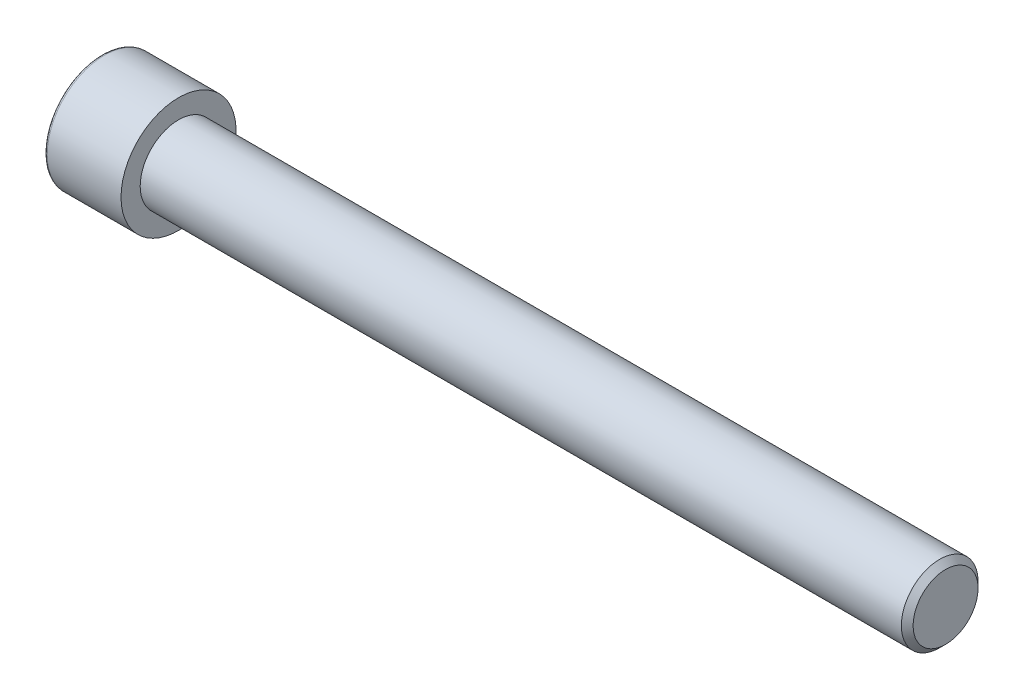
ISO-10303-21;
HEADER;
FILE_DESCRIPTION(('STEP AP214'),'2;1');
FILE_NAME('part.step','',(''),(''),'','','');
FILE_SCHEMA(('AUTOMOTIVE_DESIGN { 1 0 10303 214 1 1 1 1 }'));
ENDSEC;
DATA;
#1=APPLICATION_CONTEXT('core data for automotive mechanical design processes');
#2=APPLICATION_PROTOCOL_DEFINITION('international standard','automotive_design',2000,#1);
#3=PRODUCT_CONTEXT('',#1,'mechanical');
#4=PRODUCT('Part','Part','',(#3));
#5=PRODUCT_RELATED_PRODUCT_CATEGORY('part','',(#4));
#6=PRODUCT_DEFINITION_FORMATION('','',#4);
#7=PRODUCT_DEFINITION_CONTEXT('part definition',#1,'design');
#8=PRODUCT_DEFINITION('design','',#6,#7);
#9=PRODUCT_DEFINITION_SHAPE('','',#8);
#10=(LENGTH_UNIT() NAMED_UNIT(*) SI_UNIT(.MILLI.,.METRE.));
#11=(NAMED_UNIT(*) PLANE_ANGLE_UNIT() SI_UNIT($,.RADIAN.));
#12=(NAMED_UNIT(*) SI_UNIT($,.STERADIAN.) SOLID_ANGLE_UNIT());
#13=UNCERTAINTY_MEASURE_WITH_UNIT(LENGTH_MEASURE(1.E-05),#10,'distance_accuracy_value','');
#14=(GEOMETRIC_REPRESENTATION_CONTEXT(3) GLOBAL_UNCERTAINTY_ASSIGNED_CONTEXT((#13)) GLOBAL_UNIT_ASSIGNED_CONTEXT((#10,
#11,#12)) REPRESENTATION_CONTEXT('',''));
#15=CARTESIAN_POINT('',(0.,0.,0.));
#16=DIRECTION('',(0.,0.,1.));
#17=DIRECTION('',(1.,0.,0.));
#18=AXIS2_PLACEMENT_3D('',#15,#16,#17);
#19=CARTESIAN_POINT('',(0.,0.,0.));
#20=DIRECTION('',(1.,0.,0.));
#21=DIRECTION('',(0.,0.,-1.));
#22=AXIS2_PLACEMENT_3D('',#19,#20,#21);
#23=PLANE('',#22);
#24=DIRECTION('',(0.,-0.5,0.866025403784439));
#25=VECTOR('',#24,1.);
#26=CARTESIAN_POINT('',(0.,8.08290376865476,0.));
#27=LINE('',#26,#25);
#28=CARTESIAN_POINT('',(0.,8.08290376865476,0.));
#29=VERTEX_POINT('',#28);
#30=CARTESIAN_POINT('',(0.,4.04145188432738,7.));
#31=VERTEX_POINT('',#30);
#32=EDGE_CURVE('E100',#29,#31,#27,.T.);
#33=ORIENTED_EDGE('',*,*,#32,.T.);
#34=DIRECTION('',(0.,-1.,0.));
#35=VECTOR('',#34,1.);
#36=CARTESIAN_POINT('',(0.,4.04145188432738,7.));
#37=LINE('',#36,#35);
#38=CARTESIAN_POINT('',(0.,-4.04145188432738,7.));
#39=VERTEX_POINT('',#38);
#40=EDGE_CURVE('E107',#31,#39,#37,.T.);
#41=ORIENTED_EDGE('',*,*,#40,.T.);
#42=DIRECTION('',(0.,-0.5,-0.866025403784439));
#43=VECTOR('',#42,1.);
#44=CARTESIAN_POINT('',(0.,-4.04145188432738,7.));
#45=LINE('',#44,#43);
#46=CARTESIAN_POINT('',(0.,-8.08290376865476,0.));
#47=VERTEX_POINT('',#46);
#48=EDGE_CURVE('E113',#39,#47,#45,.T.);
#49=ORIENTED_EDGE('',*,*,#48,.T.);
#50=DIRECTION('',(0.,0.5,-0.866025403784439));
#51=VECTOR('',#50,1.);
#52=CARTESIAN_POINT('',(0.,-8.08290376865476,0.));
#53=LINE('',#52,#51);
#54=CARTESIAN_POINT('',(0.,-4.04145188432738,-7.));
#55=VERTEX_POINT('',#54);
#56=EDGE_CURVE('E122',#47,#55,#53,.T.);
#57=ORIENTED_EDGE('',*,*,#56,.T.);
#58=DIRECTION('',(0.,1.,0.));
#59=VECTOR('',#58,1.);
#60=CARTESIAN_POINT('',(0.,-4.04145188432738,-7.));
#61=LINE('',#60,#59);
#62=CARTESIAN_POINT('',(0.,4.04145188432738,-7.));
#63=VERTEX_POINT('',#62);
#64=EDGE_CURVE('E125',#55,#63,#61,.T.);
#65=ORIENTED_EDGE('',*,*,#64,.T.);
#66=DIRECTION('',(0.,0.5,0.866025403784439));
#67=VECTOR('',#66,1.);
#68=CARTESIAN_POINT('',(0.,4.04145188432738,-7.));
#69=LINE('',#68,#67);
#70=EDGE_CURVE('E118',#63,#29,#69,.T.);
#71=ORIENTED_EDGE('',*,*,#70,.T.);
#72=EDGE_LOOP('',(#33,#41,#49,#57,#65,#71));
#73=FACE_BOUND('',#72,.T.);
#74=CARTESIAN_POINT('',(0.,0.,0.));
#75=DIRECTION('',(-1.,0.,0.));
#76=DIRECTION('',(0.,0.,1.));
#77=AXIS2_PLACEMENT_3D('',#74,#75,#76);
#78=CIRCLE('',#77,11.4);
#79=CARTESIAN_POINT('',(0.,0.,11.4));
#80=VERTEX_POINT('',#79);
#81=EDGE_CURVE('E142',#80,#80,#78,.T.);
#82=ORIENTED_EDGE('',*,*,#81,.T.);
#83=EDGE_LOOP('',(#82));
#84=FACE_BOUND('',#83,.T.);
#85=ADVANCED_FACE('F39',(#73,#84),#23,.F.);
#86=CARTESIAN_POINT('',(16.,12.,0.));
#87=DIRECTION('',(-1.,0.,0.));
#88=DIRECTION('',(0.,0.,1.));
#89=AXIS2_PLACEMENT_3D('',#86,#87,#88);
#90=PLANE('',#89);
#91=CARTESIAN_POINT('',(16.,0.,0.));
#92=DIRECTION('',(-1.,0.,0.));
#93=DIRECTION('',(0.,0.,1.));
#94=AXIS2_PLACEMENT_3D('',#91,#92,#93);
#95=CIRCLE('',#94,12.);
#96=CARTESIAN_POINT('',(16.,0.,12.));
#97=VERTEX_POINT('',#96);
#98=EDGE_CURVE('E148',#97,#97,#95,.T.);
#99=ORIENTED_EDGE('',*,*,#98,.F.);
#100=EDGE_LOOP('',(#99));
#101=FACE_BOUND('',#100,.T.);
#102=CARTESIAN_POINT('',(16.,0.,0.));
#103=DIRECTION('',(-1.,0.,0.));
#104=DIRECTION('',(0.,0.,1.));
#105=AXIS2_PLACEMENT_3D('',#102,#103,#104);
#106=CIRCLE('',#105,8.);
#107=CARTESIAN_POINT('',(16.,0.,8.));
#108=VERTEX_POINT('',#107);
#109=EDGE_CURVE('E151',#108,#108,#106,.F.);
#110=ORIENTED_EDGE('',*,*,#109,.F.);
#111=EDGE_LOOP('',(#110));
#112=FACE_BOUND('',#111,.T.);
#113=ADVANCED_FACE('F210',(#101,#112),#90,.F.);
#114=CARTESIAN_POINT('',(16.,0.,0.));
#115=DIRECTION('',(-1.,0.,0.));
#116=DIRECTION('',(0.,0.,1.));
#117=AXIS2_PLACEMENT_3D('',#114,#115,#116);
#118=CYLINDRICAL_SURFACE('',#117,12.);
#119=CARTESIAN_POINT('',(0.6,0.,0.));
#120=DIRECTION('',(-1.,0.,0.));
#121=DIRECTION('',(0.,0.,1.));
#122=AXIS2_PLACEMENT_3D('',#119,#120,#121);
#123=CIRCLE('',#122,12.);
#124=CARTESIAN_POINT('',(0.6,0.,12.));
#125=VERTEX_POINT('',#124);
#126=EDGE_CURVE('E145',#125,#125,#123,.T.);
#127=ORIENTED_EDGE('',*,*,#126,.F.);
#128=EDGE_LOOP('',(#127));
#129=FACE_BOUND('',#128,.T.);
#130=ORIENTED_EDGE('',*,*,#98,.T.);
#131=EDGE_LOOP('',(#130));
#132=FACE_BOUND('',#131,.T.);
#133=ADVANCED_FACE('F214',(#129,#132),#118,.T.);
#134=CARTESIAN_POINT('',(0.600000000000005,0.,0.));
#135=DIRECTION('',(-1.,0.,0.));
#136=DIRECTION('',(0.,0.,1.));
#137=AXIS2_PLACEMENT_3D('',#134,#135,#136);
#138=TOROIDAL_SURFACE('',#137,11.4,0.600000000000009);
#139=ORIENTED_EDGE('',*,*,#126,.T.);
#140=EDGE_LOOP('',(#139));
#141=FACE_BOUND('',#140,.T.);
#142=ORIENTED_EDGE('',*,*,#81,.F.);
#143=EDGE_LOOP('',(#142));
#144=FACE_BOUND('',#143,.T.);
#145=ADVANCED_FACE('F220',(#141,#144),#138,.T.);
#146=CARTESIAN_POINT('',(176.,0.,0.));
#147=DIRECTION('',(-1.,0.,0.));
#148=DIRECTION('',(0.,0.,1.));
#149=AXIS2_PLACEMENT_3D('',#146,#147,#148);
#150=CYLINDRICAL_SURFACE('',#149,8.);
#151=ORIENTED_EDGE('',*,*,#109,.T.);
#152=EDGE_LOOP('',(#151));
#153=FACE_BOUND('',#152,.T.);
#154=CARTESIAN_POINT('',(174.773,0.,0.));
#155=DIRECTION('',(-1.,0.,0.));
#156=DIRECTION('',(0.,0.,1.));
#157=AXIS2_PLACEMENT_3D('',#154,#155,#156);
#158=CIRCLE('',#157,8.);
#159=CARTESIAN_POINT('',(174.773,0.,8.));
#160=VERTEX_POINT('',#159);
#161=EDGE_CURVE('E139',#160,#160,#158,.T.);
#162=ORIENTED_EDGE('',*,*,#161,.T.);
#163=EDGE_LOOP('',(#162));
#164=FACE_BOUND('',#163,.T.);
#165=ADVANCED_FACE('F227',(#153,#164),#150,.T.);
#166=CARTESIAN_POINT('',(176.,0.,0.));
#167=DIRECTION('',(-1.,0.,0.));
#168=DIRECTION('',(0.,0.,1.));
#169=AXIS2_PLACEMENT_3D('',#166,#167,#168);
#170=CONICAL_SURFACE('',#169,6.773,0.785398163397457);
#171=ORIENTED_EDGE('',*,*,#161,.F.);
#172=EDGE_LOOP('',(#171));
#173=FACE_BOUND('',#172,.T.);
#174=CARTESIAN_POINT('',(176.,0.,0.));
#175=DIRECTION('',(-1.,0.,0.));
#176=DIRECTION('',(0.,0.,1.));
#177=AXIS2_PLACEMENT_3D('',#174,#175,#176);
#178=CIRCLE('',#177,6.773);
#179=CARTESIAN_POINT('',(176.,0.,6.773));
#180=VERTEX_POINT('',#179);
#181=EDGE_CURVE('E103',#180,#180,#178,.T.);
#182=ORIENTED_EDGE('',*,*,#181,.T.);
#183=EDGE_LOOP('',(#182));
#184=FACE_BOUND('',#183,.T.);
#185=ADVANCED_FACE('F207',(#173,#184),#170,.T.);
#186=CARTESIAN_POINT('',(176.,6.773,0.));
#187=DIRECTION('',(-1.,0.,0.));
#188=DIRECTION('',(0.,0.,1.));
#189=AXIS2_PLACEMENT_3D('',#186,#187,#188);
#190=PLANE('',#189);
#191=ORIENTED_EDGE('',*,*,#181,.F.);
#192=EDGE_LOOP('',(#191));
#193=FACE_BOUND('',#192,.T.);
#194=ADVANCED_FACE('F203',(#193),#190,.F.);
#195=CARTESIAN_POINT('',(12.,8.08290376865476,0.));
#196=DIRECTION('',(0.,-0.866025403784439,-0.5));
#197=DIRECTION('',(0.,0.5,-0.866025403784439));
#198=AXIS2_PLACEMENT_3D('',#195,#196,#197);
#199=PLANE('',#198);
#200=DIRECTION('',(-1.,0.,0.));
#201=VECTOR('',#200,1.);
#202=CARTESIAN_POINT('',(12.,8.08290376865476,0.));
#203=LINE('',#202,#201);
#204=CARTESIAN_POINT('',(8.24081062144515,8.08290376865476,0.));
#205=VERTEX_POINT('',#204);
#206=EDGE_CURVE('E128',#205,#29,#203,.T.);
#207=ORIENTED_EDGE('',*,*,#206,.F.);
#208=CARTESIAN_POINT('',(8.24074395334994,8.0830192387086,-0.000200000000000299));
#209=CARTESIAN_POINT('',(8.29202555673095,7.99418356332252,0.153667903293391));
#210=CARTESIAN_POINT('',(8.34097980978085,7.90501666556988,0.30810950055425));
#211=CARTESIAN_POINT('',(8.4335926165143,7.72595873929905,0.618246926353254));
#212=CARTESIAN_POINT('',(8.47724888570507,7.63606741609896,0.773943265295415));
#213=CARTESIAN_POINT('',(8.59941381160494,7.36495417725225,1.24352516958246));
#214=CARTESIAN_POINT('',(8.66889984688949,7.18266208641081,1.5592643327378));
#215=CARTESIAN_POINT('',(8.75038044738534,6.9098652897096,2.03176224476633));
#216=CARTESIAN_POINT('',(8.77359191890296,6.82017566928259,2.18710922425749));
#217=CARTESIAN_POINT('',(8.81251418935198,6.64039116946081,2.49850511236216));
#218=CARTESIAN_POINT('',(8.82822565100491,6.55029632658303,2.65455395772641));
#219=CARTESIAN_POINT('',(8.85174749050138,6.36995016641051,2.96692267009517));
#220=CARTESIAN_POINT('',(8.85956683512157,6.27969914366237,3.12324202693001));
#221=CARTESIAN_POINT('',(8.86714516201213,6.09911871281642,3.43601650800788));
#222=CARTESIAN_POINT('',(8.86690439329045,6.00878930722637,3.59247162790734));
#223=CARTESIAN_POINT('',(8.85516567196884,5.76131663355911,4.02110687218394));
#224=CARTESIAN_POINT('',(8.83545966104152,5.60425437562033,4.2931466828854));
#225=CARTESIAN_POINT('',(8.77297194365867,5.29117305327856,4.8354194400822));
#226=CARTESIAN_POINT('',(8.73016887967145,5.13515508991674,5.10565047951828));
#227=CARTESIAN_POINT('',(8.62317372407408,4.82144370220969,5.64901454193984));
#228=CARTESIAN_POINT('',(8.55852830921477,4.66378986193159,5.92207900330984));
#229=CARTESIAN_POINT('',(8.4118093319374,4.35083323311213,6.46413578499063));
#230=CARTESIAN_POINT('',(8.32977023275887,4.19552643669177,6.73313504715144));
#231=CARTESIAN_POINT('',(8.24074395334994,4.04133641427354,7.0002));
#232=B_SPLINE_CURVE_WITH_KNOTS('',3,(#208,#209,#210,#211,#212,#213,#214,#215,#216,#217,#218,
#219,#220,#221,#222,#223,#224,#225,#226,#227,#228,#229,#230,#231),.UNSPECIFIED.,.F.,.F.,(4,2,2,
2,2,2,2,2,2,2,2,4),(0.,0.554727910214695,1.10969417576209,2.2219327402719,2.76443041023617,
3.30688013473357,3.8487128486711,4.39052882332379,5.33376515141419,6.27787517570456,
7.2429241888324,8.20607866430097),.UNSPECIFIED.);
#233=CARTESIAN_POINT('',(8.24081062144515,4.04145188432738,7.));
#234=VERTEX_POINT('',#233);
#235=EDGE_CURVE('E11',#205,#234,#232,.T.);
#236=ORIENTED_EDGE('',*,*,#235,.T.);
#237=DIRECTION('',(-1.,0.,0.));
#238=VECTOR('',#237,1.);
#239=CARTESIAN_POINT('',(12.,4.04145188432738,7.));
#240=LINE('',#239,#238);
#241=EDGE_CURVE('E95',#234,#31,#240,.T.);
#242=ORIENTED_EDGE('',*,*,#241,.T.);
#243=ORIENTED_EDGE('',*,*,#32,.F.);
#244=EDGE_LOOP('',(#207,#236,#242,#243));
#245=FACE_BOUND('',#244,.T.);
#246=ADVANCED_FACE('F98',(#245),#199,.T.);
#247=CARTESIAN_POINT('',(12.,4.04145188432738,7.));
#248=DIRECTION('',(0.,0.,-1.));
#249=DIRECTION('',(-1.,0.,0.));
#250=AXIS2_PLACEMENT_3D('',#247,#248,#249);
#251=PLANE('',#250);
#252=ORIENTED_EDGE('',*,*,#241,.F.);
#253=CARTESIAN_POINT('',(5.57587941292219,-10.5951395559688,7.));
#254=CARTESIAN_POINT('',(5.72215788472476,-10.2913873854027,7.));
#255=CARTESIAN_POINT('',(5.86695568880045,-9.98690898111586,7.));
#256=CARTESIAN_POINT('',(6.15275105757623,-9.37611217415566,7.));
#257=CARTESIAN_POINT('',(6.29374796487649,-9.06979346424692,7.));
#258=CARTESIAN_POINT('',(6.57186848515588,-8.45322208251383,7.));
#259=CARTESIAN_POINT('',(6.70896439043919,-8.14295686634533,7.));
#260=CARTESIAN_POINT('',(6.97718199770579,-7.51986421385499,7.));
#261=CARTESIAN_POINT('',(7.10830400201994,-7.20703690814435,7.));
#262=CARTESIAN_POINT('',(7.36656028504088,-6.5695005443991,7.));
#263=CARTESIAN_POINT('',(7.49348005127018,-6.24470408202464,7.));
#264=CARTESIAN_POINT('',(7.73706702336103,-5.59121778689269,7.));
#265=CARTESIAN_POINT('',(7.85373304467385,-5.26252750927219,7.));
#266=CARTESIAN_POINT('',(8.07355811047227,-4.60143032919695,7.));
#267=CARTESIAN_POINT('',(8.17674688296708,-4.2690334243111,7.));
#268=CARTESIAN_POINT('',(8.36613945739777,-3.59949554460914,7.));
#269=CARTESIAN_POINT('',(8.45234888881718,-3.2623561820045,7.));
#270=CARTESIAN_POINT('',(8.60305564581958,-2.58479315996282,7.));
#271=CARTESIAN_POINT('',(8.66765350449936,-2.24439250484352,7.));
#272=CARTESIAN_POINT('',(8.74539831642546,-1.73091216973467,7.));
#273=CARTESIAN_POINT('',(8.7681223476882,-1.55925781299778,7.));
#274=CARTESIAN_POINT('',(8.80673620890492,-1.21518758086266,7.));
#275=CARTESIAN_POINT('',(8.82262668929935,-1.04277177952026,7.));
#276=CARTESIAN_POINT('',(8.84707027467927,-0.699545376197852,7.));
#277=CARTESIAN_POINT('',(8.85571101390069,-0.528741034985779,7.));
#278=CARTESIAN_POINT('',(8.86578587656476,-0.1869208499621,7.));
#279=CARTESIAN_POINT('',(8.86722011156257,-0.0159050094654492,7.));
#280=CARTESIAN_POINT('',(8.86284767868586,0.326038893609979,7.));
#281=CARTESIAN_POINT('',(8.85704082162707,0.496966953778641,7.));
#282=CARTESIAN_POINT('',(8.8383221933219,0.838436119348584,7.));
#283=CARTESIAN_POINT('',(8.82541002346138,1.00897720250108,7.));
#284=CARTESIAN_POINT('',(8.78532318764043,1.42691016284093,7.));
#285=CARTESIAN_POINT('',(8.75433158385114,1.67394276264429,7.));
#286=CARTESIAN_POINT('',(8.67919370737725,2.1659883041221,7.));
#287=CARTESIAN_POINT('',(8.63504542432949,2.41100093125723,7.));
#288=CARTESIAN_POINT('',(8.48522311454851,3.14282333035987,7.));
#289=CARTESIAN_POINT('',(8.36220388516809,3.62611875071593,7.));
#290=CARTESIAN_POINT('',(8.15116787960062,4.3487805325071,7.));
#291=CARTESIAN_POINT('',(8.07542139419739,4.59194251167669,7.));
#292=CARTESIAN_POINT('',(7.9166482621531,5.07590132488677,7.));
#293=CARTESIAN_POINT('',(7.83362156396132,5.31669814216627,7.));
#294=CARTESIAN_POINT('',(7.66157133885048,5.79601723780591,7.));
#295=CARTESIAN_POINT('',(7.5725500954382,6.03454034320772,7.));
#296=CARTESIAN_POINT('',(7.3894995127239,6.50964710521445,7.));
#297=CARTESIAN_POINT('',(7.29547025517154,6.74623079340525,7.));
#298=CARTESIAN_POINT('',(7.05091022334063,7.34607004782587,7.));
#299=CARTESIAN_POINT('',(6.89749500530549,7.70814802994476,7.));
#300=CARTESIAN_POINT('',(6.58311405374231,8.42902142446664,7.));
#301=CARTESIAN_POINT('',(6.4221477486436,8.78781658591592,7.));
#302=CARTESIAN_POINT('',(6.09434206590049,9.5028229612945,7.));
#303=CARTESIAN_POINT('',(5.92750112189063,9.85903345506375,7.));
#304=CARTESIAN_POINT('',(5.58925640841321,10.5692634953458,7.));
#305=CARTESIAN_POINT('',(5.41785276367774,10.9232831014262,7.));
#306=CARTESIAN_POINT('',(5.07120500870259,11.6299725078319,7.));
#307=CARTESIAN_POINT('',(4.8959564472764,11.982640120912,7.));
#308=CARTESIAN_POINT('',(4.54252537077448,12.6865021421779,7.));
#309=CARTESIAN_POINT('',(4.3643428393958,13.0376965421641,7.));
#310=CARTESIAN_POINT('',(3.82629497051468,14.0893490285881,7.));
#311=CARTESIAN_POINT('',(3.46287434288011,14.7879876175435,7.));
#312=CARTESIAN_POINT('',(2.76400520764348,16.1163630798682,7.));
#313=CARTESIAN_POINT('',(2.42913665633273,16.7464064050781,7.));
#314=CARTESIAN_POINT('',(1.75544455886196,18.0044087683408,7.));
#315=CARTESIAN_POINT('',(1.4166208425721,18.6323677152318,7.));
#316=CARTESIAN_POINT('',(0.736900591610472,19.8850342571872,7.));
#317=CARTESIAN_POINT('',(0.396011800685717,20.5097460603558,7.));
#318=CARTESIAN_POINT('',(-0.288064689435112,21.7578620874728,7.));
#319=CARTESIAN_POINT('',(-0.631252251240716,22.3812663866935,7.));
#320=CARTESIAN_POINT('',(-0.975285006989568,23.0042010690845,7.));
#321=B_SPLINE_CURVE_WITH_KNOTS('',3,(#253,#254,#255,#256,#257,#258,#259,#260,#261,#262,#263,
#264,#265,#266,#267,#268,#269,#270,#271,#272,#273,#274,#275,#276,#277,#278,#279,#280,#281,#282,
#283,#284,#285,#286,#287,#288,#289,#290,#291,#292,#293,#294,#295,#296,#297,#298,#299,#300,#301,
#302,#303,#304,#305,#306,#307,#308,#309,#310,#311,#312,#313,#314,#315,#316,#317,#318,#319,#320),
.UNSPECIFIED.,.F.,.F.,(4,2,2,2,2,2,2,2,2,2,2,2,2,2,2,2,2,2,2,2,2,2,2,2,2,2,2,2,2,2,2,2,2,4),(0.,
1.01143101724814,2.02303586270392,3.04059952013218,4.0581116227373,5.10411913857804,
6.15024733449321,7.19402754905384,8.23746111460828,9.27597104351024,9.79531214242649,
10.3146037977555,10.8275239688931,11.3404362001106,11.8533618322016,12.3663162427945,
13.1127965817182,13.8593910426537,15.3534778065278,16.1174816538324,16.8814909114363,
17.6452107630153,18.4089181516302,19.5885110371782,20.7681933551521,21.9481926318707,
23.1281596836154,24.3095735159024,25.4909939150696,27.8534625107793,29.9939673638473,
32.1345646316569,34.269560689375,36.4044302636885),.UNSPECIFIED.);
#322=CARTESIAN_POINT('',(8.24081062144515,-4.04145188432738,7.));
#323=VERTEX_POINT('',#322);
#324=EDGE_CURVE('E51',#234,#323,#321,.F.);
#325=ORIENTED_EDGE('',*,*,#324,.T.);
#326=DIRECTION('',(-1.,0.,0.));
#327=VECTOR('',#326,1.);
#328=CARTESIAN_POINT('',(12.,-4.04145188432738,7.));
#329=LINE('',#328,#327);
#330=EDGE_CURVE('E104',#323,#39,#329,.T.);
#331=ORIENTED_EDGE('',*,*,#330,.T.);
#332=ORIENTED_EDGE('',*,*,#40,.F.);
#333=EDGE_LOOP('',(#252,#325,#331,#332));
#334=FACE_BOUND('',#333,.T.);
#335=ADVANCED_FACE('F108',(#334),#251,.T.);
#336=CARTESIAN_POINT('',(12.,-4.04145188432738,7.));
#337=DIRECTION('',(0.,0.866025403784439,-0.5));
#338=DIRECTION('',(0.,0.5,0.866025403784439));
#339=AXIS2_PLACEMENT_3D('',#336,#337,#338);
#340=PLANE('',#339);
#341=ORIENTED_EDGE('',*,*,#330,.F.);
#342=CARTESIAN_POINT('',(8.24074395334994,-4.04133641427354,7.0002));
#343=CARTESIAN_POINT('',(8.29202555673095,-4.13017208965963,6.84633209670661));
#344=CARTESIAN_POINT('',(8.34097980978085,-4.21933898741226,6.69189049944575));
#345=CARTESIAN_POINT('',(8.4335926165143,-4.39839691368309,6.38175307364674));
#346=CARTESIAN_POINT('',(8.47724888570507,-4.48828823688319,6.22605673470458));
#347=CARTESIAN_POINT('',(8.59941381160494,-4.75940147572989,5.75647483041753));
#348=CARTESIAN_POINT('',(8.66889984688949,-4.94169356657133,5.4407356672622));
#349=CARTESIAN_POINT('',(8.75038044738534,-5.21449036327254,4.96823775523367));
#350=CARTESIAN_POINT('',(8.77359191890296,-5.30417998369956,4.81289077574251));
#351=CARTESIAN_POINT('',(8.81251418935198,-5.48396448352133,4.50149488763783));
#352=CARTESIAN_POINT('',(8.82822565100491,-5.57405932639911,4.34544604227359));
#353=CARTESIAN_POINT('',(8.85174749050138,-5.75440548657163,4.03307732990482));
#354=CARTESIAN_POINT('',(8.85956683512157,-5.84465650931978,3.87675797306999));
#355=CARTESIAN_POINT('',(8.86714516201213,-6.02523694016573,3.56398349199212));
#356=CARTESIAN_POINT('',(8.86690439329045,-6.11556634575578,3.40752837209266));
#357=CARTESIAN_POINT('',(8.85516567196884,-6.36303901942303,2.97889312781606));
#358=CARTESIAN_POINT('',(8.83545966104152,-6.52010127736182,2.7068533171146));
#359=CARTESIAN_POINT('',(8.77297194365867,-6.83318259970359,2.1645805599178));
#360=CARTESIAN_POINT('',(8.73016887967145,-6.9892005630654,1.89434952048172));
#361=CARTESIAN_POINT('',(8.62317372407408,-7.30291195077246,1.35098545806016));
#362=CARTESIAN_POINT('',(8.55852830921477,-7.46056579105055,1.07792099669016));
#363=CARTESIAN_POINT('',(8.4118093319374,-7.77352241987001,0.53586421500937));
#364=CARTESIAN_POINT('',(8.32977023275887,-7.92882921629037,0.266864952848559));
#365=CARTESIAN_POINT('',(8.24074395334994,-8.0830192387086,-0.000200000000000452));
#366=B_SPLINE_CURVE_WITH_KNOTS('',3,(#342,#343,#344,#345,#346,#347,#348,#349,#350,#351,#352,
#353,#354,#355,#356,#357,#358,#359,#360,#361,#362,#363,#364,#365),.UNSPECIFIED.,.F.,.F.,(4,2,2,
2,2,2,2,2,2,2,2,4),(0.,0.554727910214695,1.10969417576209,2.2219327402719,2.76443041023617,
3.30688013473358,3.8487128486711,4.39052882332379,5.33376515141419,6.27787517570456,
7.2429241888324,8.20607866430097),.UNSPECIFIED.);
#367=CARTESIAN_POINT('',(8.24081062144515,-8.08290376865476,0.));
#368=VERTEX_POINT('',#367);
#369=EDGE_CURVE('E61',#323,#368,#366,.T.);
#370=ORIENTED_EDGE('',*,*,#369,.T.);
#371=DIRECTION('',(-1.,0.,0.));
#372=VECTOR('',#371,1.);
#373=CARTESIAN_POINT('',(12.,-8.08290376865476,0.));
#374=LINE('',#373,#372);
#375=EDGE_CURVE('E134',#368,#47,#374,.T.);
#376=ORIENTED_EDGE('',*,*,#375,.T.);
#377=ORIENTED_EDGE('',*,*,#48,.F.);
#378=EDGE_LOOP('',(#341,#370,#376,#377));
#379=FACE_BOUND('',#378,.T.);
#380=ADVANCED_FACE('F183',(#379),#340,.T.);
#381=CARTESIAN_POINT('',(12.,-8.08290376865476,0.));
#382=DIRECTION('',(0.,0.866025403784439,0.5));
#383=DIRECTION('',(0.,-0.5,0.866025403784439));
#384=AXIS2_PLACEMENT_3D('',#381,#382,#383);
#385=PLANE('',#384);
#386=ORIENTED_EDGE('',*,*,#375,.F.);
#387=CARTESIAN_POINT('',(8.24074395334994,-8.0830192387086,0.000200000000000299));
#388=CARTESIAN_POINT('',(8.29202555673095,-7.99418356332252,-0.153667903293391));
#389=CARTESIAN_POINT('',(8.34097980978085,-7.90501666556988,-0.30810950055425));
#390=CARTESIAN_POINT('',(8.4335926165143,-7.72595873929905,-0.618246926353254));
#391=CARTESIAN_POINT('',(8.47724888570507,-7.63606741609896,-0.773943265295415));
#392=CARTESIAN_POINT('',(8.59941381160494,-7.36495417725225,-1.24352516958246));
#393=CARTESIAN_POINT('',(8.66889984688949,-7.18266208641081,-1.5592643327378));
#394=CARTESIAN_POINT('',(8.75038044738534,-6.9098652897096,-2.03176224476633));
#395=CARTESIAN_POINT('',(8.77359191890296,-6.82017566928259,-2.18710922425749));
#396=CARTESIAN_POINT('',(8.81251418935198,-6.64039116946081,-2.49850511236216));
#397=CARTESIAN_POINT('',(8.82822565100491,-6.55029632658303,-2.65455395772641));
#398=CARTESIAN_POINT('',(8.85174749050138,-6.36995016641051,-2.96692267009517));
#399=CARTESIAN_POINT('',(8.85956683512157,-6.27969914366237,-3.12324202693001));
#400=CARTESIAN_POINT('',(8.86714516201213,-6.09911871281642,-3.43601650800788));
#401=CARTESIAN_POINT('',(8.86690439329045,-6.00878930722637,-3.59247162790734));
#402=CARTESIAN_POINT('',(8.85516567196884,-5.76131663355911,-4.02110687218394));
#403=CARTESIAN_POINT('',(8.83545966104152,-5.60425437562033,-4.2931466828854));
#404=CARTESIAN_POINT('',(8.77297194365867,-5.29117305327856,-4.8354194400822));
#405=CARTESIAN_POINT('',(8.73016887967145,-5.13515508991674,-5.10565047951828));
#406=CARTESIAN_POINT('',(8.62317372407408,-4.82144370220969,-5.64901454193984));
#407=CARTESIAN_POINT('',(8.55852830921477,-4.66378986193159,-5.92207900330984));
#408=CARTESIAN_POINT('',(8.4118093319374,-4.35083323311213,-6.46413578499063));
#409=CARTESIAN_POINT('',(8.32977023275887,-4.19552643669177,-6.73313504715144));
#410=CARTESIAN_POINT('',(8.24074395334994,-4.04133641427354,-7.0002));
#411=B_SPLINE_CURVE_WITH_KNOTS('',3,(#387,#388,#389,#390,#391,#392,#393,#394,#395,#396,#397,
#398,#399,#400,#401,#402,#403,#404,#405,#406,#407,#408,#409,#410),.UNSPECIFIED.,.F.,.F.,(4,2,2,
2,2,2,2,2,2,2,2,4),(0.,0.554727910214695,1.10969417576209,2.2219327402719,2.76443041023617,
3.30688013473357,3.8487128486711,4.39052882332379,5.33376515141419,6.27787517570456,
7.2429241888324,8.20607866430097),.UNSPECIFIED.);
#412=CARTESIAN_POINT('',(8.24081062144515,-4.04145188432738,-7.));
#413=VERTEX_POINT('',#412);
#414=EDGE_CURVE('E187',#368,#413,#411,.T.);
#415=ORIENTED_EDGE('',*,*,#414,.T.);
#416=DIRECTION('',(-1.,0.,0.));
#417=VECTOR('',#416,1.);
#418=CARTESIAN_POINT('',(12.,-4.04145188432738,-7.));
#419=LINE('',#418,#417);
#420=EDGE_CURVE('E132',#413,#55,#419,.T.);
#421=ORIENTED_EDGE('',*,*,#420,.T.);
#422=ORIENTED_EDGE('',*,*,#56,.F.);
#423=EDGE_LOOP('',(#386,#415,#421,#422));
#424=FACE_BOUND('',#423,.T.);
#425=ADVANCED_FACE('F178',(#424),#385,.T.);
#426=CARTESIAN_POINT('',(12.,-4.04145188432738,-7.));
#427=DIRECTION('',(0.,0.,1.));
#428=DIRECTION('',(1.,0.,0.));
#429=AXIS2_PLACEMENT_3D('',#426,#427,#428);
#430=PLANE('',#429);
#431=ORIENTED_EDGE('',*,*,#420,.F.);
#432=CARTESIAN_POINT('',(5.57587941292219,-10.5951395559688,-7.));
#433=CARTESIAN_POINT('',(5.72215788472476,-10.2913873854027,-7.));
#434=CARTESIAN_POINT('',(5.86695568880045,-9.98690898111586,-7.));
#435=CARTESIAN_POINT('',(6.15275105757623,-9.37611217415566,-7.));
#436=CARTESIAN_POINT('',(6.29374796487649,-9.06979346424692,-7.));
#437=CARTESIAN_POINT('',(6.57186848515588,-8.45322208251383,-7.));
#438=CARTESIAN_POINT('',(6.70896439043919,-8.14295686634533,-7.));
#439=CARTESIAN_POINT('',(6.97718199770579,-7.51986421385499,-7.));
#440=CARTESIAN_POINT('',(7.10830400201994,-7.20703690814435,-7.));
#441=CARTESIAN_POINT('',(7.36656028504088,-6.5695005443991,-7.));
#442=CARTESIAN_POINT('',(7.49348005127018,-6.24470408202464,-7.));
#443=CARTESIAN_POINT('',(7.73706702336103,-5.59121778689269,-7.));
#444=CARTESIAN_POINT('',(7.85373304467385,-5.26252750927219,-7.));
#445=CARTESIAN_POINT('',(8.07355811047227,-4.60143032919695,-7.));
#446=CARTESIAN_POINT('',(8.17674688296708,-4.2690334243111,-7.));
#447=CARTESIAN_POINT('',(8.36613945739777,-3.59949554460914,-7.));
#448=CARTESIAN_POINT('',(8.45234888881718,-3.2623561820045,-7.));
#449=CARTESIAN_POINT('',(8.60305564581958,-2.58479315996282,-7.));
#450=CARTESIAN_POINT('',(8.66765350449936,-2.24439250484352,-7.));
#451=CARTESIAN_POINT('',(8.74539831642546,-1.73091216973467,-7.));
#452=CARTESIAN_POINT('',(8.7681223476882,-1.55925781299778,-7.));
#453=CARTESIAN_POINT('',(8.80673620890492,-1.21518758086266,-7.));
#454=CARTESIAN_POINT('',(8.82262668929935,-1.04277177952026,-7.));
#455=CARTESIAN_POINT('',(8.84707027467927,-0.699545376197852,-7.));
#456=CARTESIAN_POINT('',(8.85571101390069,-0.528741034985779,-7.));
#457=CARTESIAN_POINT('',(8.86578587656476,-0.1869208499621,-7.));
#458=CARTESIAN_POINT('',(8.86722011156257,-0.0159050094654492,-7.));
#459=CARTESIAN_POINT('',(8.86284767868586,0.326038893609979,-7.));
#460=CARTESIAN_POINT('',(8.85704082162707,0.496966953778641,-7.));
#461=CARTESIAN_POINT('',(8.8383221933219,0.838436119348584,-7.));
#462=CARTESIAN_POINT('',(8.82541002346138,1.00897720250108,-7.));
#463=CARTESIAN_POINT('',(8.78532318764043,1.42691016284093,-7.));
#464=CARTESIAN_POINT('',(8.75433158385114,1.67394276264429,-7.));
#465=CARTESIAN_POINT('',(8.67919370737725,2.1659883041221,-7.));
#466=CARTESIAN_POINT('',(8.63504542432949,2.41100093125723,-7.));
#467=CARTESIAN_POINT('',(8.48522311454851,3.14282333035987,-7.));
#468=CARTESIAN_POINT('',(8.36220388516809,3.62611875071593,-7.));
#469=CARTESIAN_POINT('',(8.15116787960062,4.3487805325071,-7.));
#470=CARTESIAN_POINT('',(8.07542139419739,4.59194251167669,-7.));
#471=CARTESIAN_POINT('',(7.9166482621531,5.07590132488677,-7.));
#472=CARTESIAN_POINT('',(7.83362156396132,5.31669814216627,-7.));
#473=CARTESIAN_POINT('',(7.66157133885048,5.79601723780591,-7.));
#474=CARTESIAN_POINT('',(7.5725500954382,6.03454034320772,-7.));
#475=CARTESIAN_POINT('',(7.3894995127239,6.50964710521445,-7.));
#476=CARTESIAN_POINT('',(7.29547025517154,6.74623079340525,-7.));
#477=CARTESIAN_POINT('',(7.05091022334063,7.34607004782587,-7.));
#478=CARTESIAN_POINT('',(6.89749500530549,7.70814802994476,-7.));
#479=CARTESIAN_POINT('',(6.58311405374231,8.42902142446664,-7.));
#480=CARTESIAN_POINT('',(6.4221477486436,8.78781658591592,-7.));
#481=CARTESIAN_POINT('',(6.09434206590049,9.5028229612945,-7.));
#482=CARTESIAN_POINT('',(5.92750112189063,9.85903345506375,-7.));
#483=CARTESIAN_POINT('',(5.58925640841321,10.5692634953458,-7.));
#484=CARTESIAN_POINT('',(5.41785276367774,10.9232831014262,-7.));
#485=CARTESIAN_POINT('',(5.07120500870259,11.6299725078319,-7.));
#486=CARTESIAN_POINT('',(4.8959564472764,11.982640120912,-7.));
#487=CARTESIAN_POINT('',(4.54252537077448,12.6865021421779,-7.));
#488=CARTESIAN_POINT('',(4.3643428393958,13.0376965421641,-7.));
#489=CARTESIAN_POINT('',(3.82629497051468,14.0893490285881,-7.));
#490=CARTESIAN_POINT('',(3.46287434288011,14.7879876175435,-7.));
#491=CARTESIAN_POINT('',(2.76400520764348,16.1163630798682,-7.));
#492=CARTESIAN_POINT('',(2.42913665633273,16.7464064050781,-7.));
#493=CARTESIAN_POINT('',(1.75544455886196,18.0044087683408,-7.));
#494=CARTESIAN_POINT('',(1.4166208425721,18.6323677152318,-7.));
#495=CARTESIAN_POINT('',(0.736900591610472,19.8850342571872,-7.));
#496=CARTESIAN_POINT('',(0.396011800685717,20.5097460603558,-7.));
#497=CARTESIAN_POINT('',(-0.288064689435112,21.7578620874728,-7.));
#498=CARTESIAN_POINT('',(-0.631252251240716,22.3812663866935,-7.));
#499=CARTESIAN_POINT('',(-0.975285006989568,23.0042010690845,-7.));
#500=B_SPLINE_CURVE_WITH_KNOTS('',3,(#432,#433,#434,#435,#436,#437,#438,#439,#440,#441,#442,
#443,#444,#445,#446,#447,#448,#449,#450,#451,#452,#453,#454,#455,#456,#457,#458,#459,#460,#461,
#462,#463,#464,#465,#466,#467,#468,#469,#470,#471,#472,#473,#474,#475,#476,#477,#478,#479,#480,
#481,#482,#483,#484,#485,#486,#487,#488,#489,#490,#491,#492,#493,#494,#495,#496,#497,#498,#499),
.UNSPECIFIED.,.F.,.F.,(4,2,2,2,2,2,2,2,2,2,2,2,2,2,2,2,2,2,2,2,2,2,2,2,2,2,2,2,2,2,2,2,2,4),(0.,
1.01143101724814,2.02303586270392,3.04059952013218,4.0581116227373,5.10411913857804,
6.15024733449321,7.19402754905384,8.23746111460828,9.27597104351024,9.79531214242649,
10.3146037977555,10.8275239688931,11.3404362001106,11.8533618322016,12.3663162427945,
13.1127965817182,13.8593910426537,15.3534778065278,16.1174816538324,16.8814909114363,
17.6452107630153,18.4089181516302,19.5885110371782,20.7681933551521,21.9481926318707,
23.1281596836154,24.3095735159024,25.4909939150696,27.8534625107793,29.9939673638473,
32.1345646316569,34.269560689375,36.4044302636885),.UNSPECIFIED.);
#501=CARTESIAN_POINT('',(8.24081062144515,4.04145188432738,-7.));
#502=VERTEX_POINT('',#501);
#503=EDGE_CURVE('E161',#413,#502,#500,.T.);
#504=ORIENTED_EDGE('',*,*,#503,.T.);
#505=DIRECTION('',(-1.,0.,0.));
#506=VECTOR('',#505,1.);
#507=CARTESIAN_POINT('',(12.,4.04145188432738,-7.));
#508=LINE('',#507,#506);
#509=EDGE_CURVE('E130',#502,#63,#508,.T.);
#510=ORIENTED_EDGE('',*,*,#509,.T.);
#511=ORIENTED_EDGE('',*,*,#64,.F.);
#512=EDGE_LOOP('',(#431,#504,#510,#511));
#513=FACE_BOUND('',#512,.T.);
#514=ADVANCED_FACE('F173',(#513),#430,.T.);
#515=CARTESIAN_POINT('',(12.,4.04145188432738,-7.));
#516=DIRECTION('',(0.,-0.866025403784439,0.5));
#517=DIRECTION('',(0.,-0.5,-0.866025403784439));
#518=AXIS2_PLACEMENT_3D('',#515,#516,#517);
#519=PLANE('',#518);
#520=ORIENTED_EDGE('',*,*,#509,.F.);
#521=CARTESIAN_POINT('',(8.24074395334994,4.04133641427354,-7.0002));
#522=CARTESIAN_POINT('',(8.29202555673095,4.13017208965963,-6.84633209670661));
#523=CARTESIAN_POINT('',(8.34097980978085,4.21933898741226,-6.69189049944575));
#524=CARTESIAN_POINT('',(8.4335926165143,4.39839691368309,-6.38175307364674));
#525=CARTESIAN_POINT('',(8.47724888570507,4.48828823688319,-6.22605673470458));
#526=CARTESIAN_POINT('',(8.59941381160494,4.75940147572989,-5.75647483041753));
#527=CARTESIAN_POINT('',(8.66889984688949,4.94169356657133,-5.4407356672622));
#528=CARTESIAN_POINT('',(8.75038044738534,5.21449036327254,-4.96823775523367));
#529=CARTESIAN_POINT('',(8.77359191890296,5.30417998369956,-4.81289077574251));
#530=CARTESIAN_POINT('',(8.81251418935198,5.48396448352133,-4.50149488763783));
#531=CARTESIAN_POINT('',(8.82822565100491,5.57405932639911,-4.34544604227359));
#532=CARTESIAN_POINT('',(8.85174749050138,5.75440548657163,-4.03307732990482));
#533=CARTESIAN_POINT('',(8.85956683512157,5.84465650931978,-3.87675797306999));
#534=CARTESIAN_POINT('',(8.86714516201213,6.02523694016573,-3.56398349199212));
#535=CARTESIAN_POINT('',(8.86690439329045,6.11556634575578,-3.40752837209266));
#536=CARTESIAN_POINT('',(8.85516567196884,6.36303901942303,-2.97889312781606));
#537=CARTESIAN_POINT('',(8.83545966104152,6.52010127736182,-2.7068533171146));
#538=CARTESIAN_POINT('',(8.77297194365867,6.83318259970359,-2.1645805599178));
#539=CARTESIAN_POINT('',(8.73016887967145,6.9892005630654,-1.89434952048172));
#540=CARTESIAN_POINT('',(8.62317372407408,7.30291195077246,-1.35098545806016));
#541=CARTESIAN_POINT('',(8.55852830921477,7.46056579105055,-1.07792099669016));
#542=CARTESIAN_POINT('',(8.4118093319374,7.77352241987001,-0.53586421500937));
#543=CARTESIAN_POINT('',(8.32977023275887,7.92882921629037,-0.266864952848559));
#544=CARTESIAN_POINT('',(8.24074395334994,8.0830192387086,0.000200000000000452));
#545=B_SPLINE_CURVE_WITH_KNOTS('',3,(#521,#522,#523,#524,#525,#526,#527,#528,#529,#530,#531,
#532,#533,#534,#535,#536,#537,#538,#539,#540,#541,#542,#543,#544),.UNSPECIFIED.,.F.,.F.,(4,2,2,
2,2,2,2,2,2,2,2,4),(0.,0.554727910214695,1.10969417576209,2.2219327402719,2.76443041023617,
3.30688013473358,3.8487128486711,4.39052882332379,5.33376515141419,6.27787517570456,
7.2429241888324,8.20607866430097),.UNSPECIFIED.);
#546=EDGE_CURVE('E154',#502,#205,#545,.T.);
#547=ORIENTED_EDGE('',*,*,#546,.T.);
#548=ORIENTED_EDGE('',*,*,#206,.T.);
#549=ORIENTED_EDGE('',*,*,#70,.F.);
#550=EDGE_LOOP('',(#520,#547,#548,#549));
#551=FACE_BOUND('',#550,.T.);
#552=ADVANCED_FACE('F170',(#551),#519,.T.);
#553=CARTESIAN_POINT('',(12.9074772881118,0.,0.));
#554=DIRECTION('',(-1.,0.,0.));
#555=DIRECTION('',(0.,0.,1.));
#556=AXIS2_PLACEMENT_3D('',#553,#554,#555);
#557=CONICAL_SURFACE('',#556,0.,1.0471975511966);
#558=ORIENTED_EDGE('',*,*,#235,.F.);
#559=ORIENTED_EDGE('',*,*,#546,.F.);
#560=ORIENTED_EDGE('',*,*,#503,.F.);
#561=ORIENTED_EDGE('',*,*,#414,.F.);
#562=ORIENTED_EDGE('',*,*,#369,.F.);
#563=ORIENTED_EDGE('',*,*,#324,.F.);
#564=EDGE_LOOP('',(#558,#559,#560,#561,#562,#563));
#565=FACE_BOUND('',#564,.T.);
#566=CARTESIAN_POINT('',(12.9074772881118,0.,0.));
#567=VERTEX_POINT('',#566);
#568=VERTEX_LOOP('',#567);
#569=FACE_BOUND('',#568,.T.);
#570=ADVANCED_FACE('F167',(#565,#569),#557,.F.);
#571=CLOSED_SHELL('',(#85,#113,#133,#145,#165,#185,#194,#246,#335,#380,#425,#514,#552,#570));
#572=MANIFOLD_SOLID_BREP('B2',#571);
#573=ADVANCED_BREP_SHAPE_REPRESENTATION('',(#18,#572),#14);
#574=SHAPE_DEFINITION_REPRESENTATION(#9,#573);
ENDSEC;
END-ISO-10303-21;
